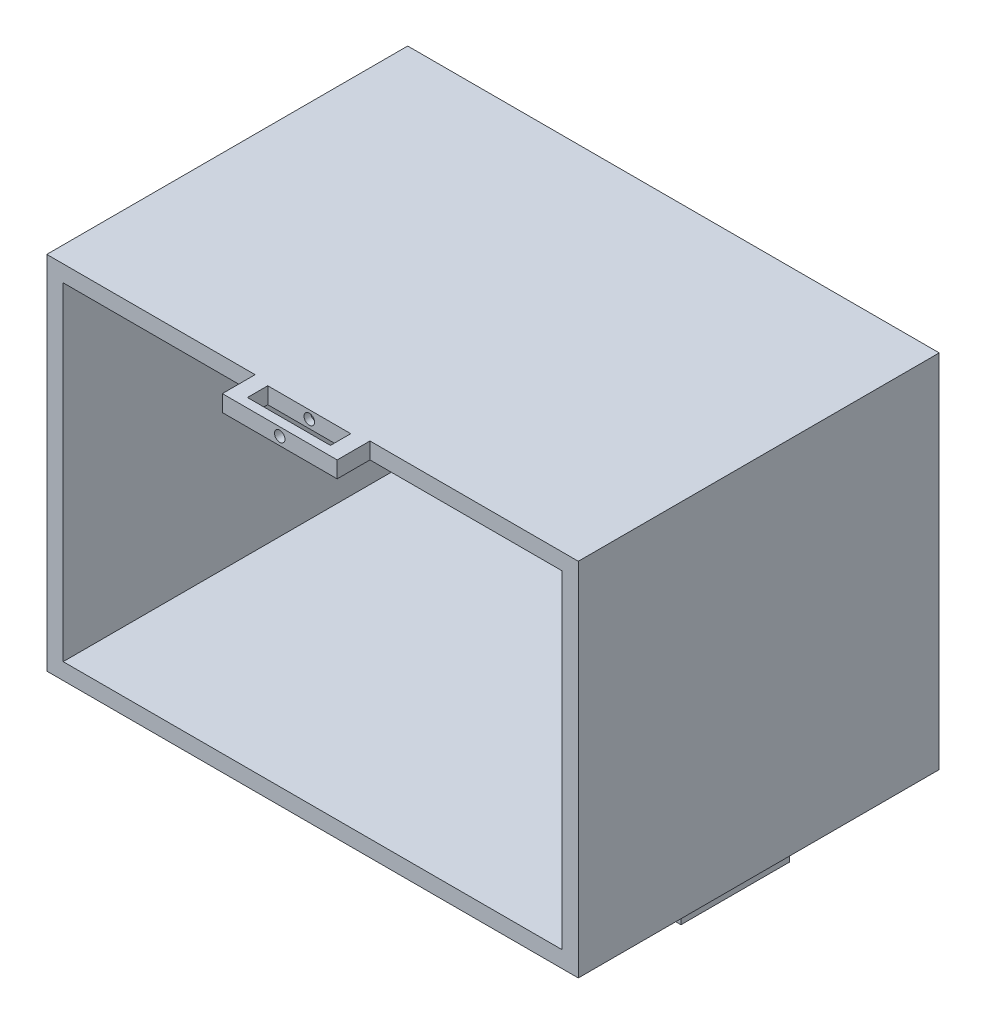
ISO-10303-21;
HEADER;
FILE_DESCRIPTION(('STEP AP214'),'2;1');
FILE_NAME('part.step','',(''),(''),'','','');
FILE_SCHEMA(('AUTOMOTIVE_DESIGN { 1 0 10303 214 1 1 1 1 }'));
ENDSEC;
DATA;
#1=APPLICATION_CONTEXT('core data for automotive mechanical design processes');
#2=APPLICATION_PROTOCOL_DEFINITION('international standard','automotive_design',2000,#1);
#3=PRODUCT_CONTEXT('',#1,'mechanical');
#4=PRODUCT('Part','Part','',(#3));
#5=PRODUCT_RELATED_PRODUCT_CATEGORY('part','',(#4));
#6=PRODUCT_DEFINITION_FORMATION('','',#4);
#7=PRODUCT_DEFINITION_CONTEXT('part definition',#1,'design');
#8=PRODUCT_DEFINITION('design','',#6,#7);
#9=PRODUCT_DEFINITION_SHAPE('','',#8);
#10=(LENGTH_UNIT() NAMED_UNIT(*) SI_UNIT(.MILLI.,.METRE.));
#11=(NAMED_UNIT(*) PLANE_ANGLE_UNIT() SI_UNIT($,.RADIAN.));
#12=(NAMED_UNIT(*) SI_UNIT($,.STERADIAN.) SOLID_ANGLE_UNIT());
#13=UNCERTAINTY_MEASURE_WITH_UNIT(LENGTH_MEASURE(1.E-05),#10,'distance_accuracy_value','');
#14=(GEOMETRIC_REPRESENTATION_CONTEXT(3) GLOBAL_UNCERTAINTY_ASSIGNED_CONTEXT((#13)) GLOBAL_UNIT_ASSIGNED_CONTEXT((#10,
#11,#12)) REPRESENTATION_CONTEXT('',''));
#15=CARTESIAN_POINT('',(0.,0.,0.));
#16=DIRECTION('',(0.,0.,1.));
#17=DIRECTION('',(1.,0.,0.));
#18=AXIS2_PLACEMENT_3D('',#15,#16,#17);
#19=CARTESIAN_POINT('',(0.,0.,55.));
#20=DIRECTION('',(0.,0.,1.));
#21=DIRECTION('',(1.,0.,0.));
#22=AXIS2_PLACEMENT_3D('',#19,#20,#21);
#23=PLANE('',#22);
#24=DIRECTION('',(-1.,0.,0.));
#25=VECTOR('',#24,1.);
#26=CARTESIAN_POINT('',(-81.,50.,55.));
#27=LINE('',#26,#25);
#28=CARTESIAN_POINT('',(-17.5,50.,55.));
#29=VERTEX_POINT('',#28);
#30=CARTESIAN_POINT('',(-76.,50.,55.));
#31=VERTEX_POINT('',#30);
#32=EDGE_CURVE('E433',#29,#31,#27,.T.);
#33=ORIENTED_EDGE('',*,*,#32,.F.);
#34=DIRECTION('',(0.,1.,0.));
#35=VECTOR('',#34,1.);
#36=CARTESIAN_POINT('',(-17.5,55.,55.));
#37=LINE('',#36,#35);
#38=CARTESIAN_POINT('',(-17.5,55.,55.));
#39=VERTEX_POINT('',#38);
#40=EDGE_CURVE('E271',#29,#39,#37,.T.);
#41=ORIENTED_EDGE('',*,*,#40,.T.);
#42=DIRECTION('',(-1.,0.,0.));
#43=VECTOR('',#42,1.);
#44=CARTESIAN_POINT('',(-81.,55.,55.));
#45=LINE('',#44,#43);
#46=CARTESIAN_POINT('',(-81.,55.,55.));
#47=VERTEX_POINT('',#46);
#48=EDGE_CURVE('E444',#39,#47,#45,.T.);
#49=ORIENTED_EDGE('',*,*,#48,.T.);
#50=DIRECTION('',(0.,-1.,0.));
#51=VECTOR('',#50,1.);
#52=CARTESIAN_POINT('',(-81.,55.,55.));
#53=LINE('',#52,#51);
#54=CARTESIAN_POINT('',(-81.,-55.,55.));
#55=VERTEX_POINT('',#54);
#56=EDGE_CURVE('E448',#47,#55,#53,.T.);
#57=ORIENTED_EDGE('',*,*,#56,.T.);
#58=DIRECTION('',(1.,0.,0.));
#59=VECTOR('',#58,1.);
#60=CARTESIAN_POINT('',(-81.,-55.,55.));
#61=LINE('',#60,#59);
#62=CARTESIAN_POINT('',(81.,-55.,55.));
#63=VERTEX_POINT('',#62);
#64=EDGE_CURVE('E450',#55,#63,#61,.T.);
#65=ORIENTED_EDGE('',*,*,#64,.T.);
#66=DIRECTION('',(0.,1.,0.));
#67=VECTOR('',#66,1.);
#68=CARTESIAN_POINT('',(81.,55.,55.));
#69=LINE('',#68,#67);
#70=CARTESIAN_POINT('',(81.,55.,55.));
#71=VERTEX_POINT('',#70);
#72=EDGE_CURVE('E441',#63,#71,#69,.T.);
#73=ORIENTED_EDGE('',*,*,#72,.T.);
#74=CARTESIAN_POINT('',(17.5,55.,55.));
#75=VERTEX_POINT('',#74);
#76=EDGE_CURVE('E446',#71,#75,#45,.T.);
#77=ORIENTED_EDGE('',*,*,#76,.T.);
#78=DIRECTION('',(0.,1.,0.));
#79=VECTOR('',#78,1.);
#80=CARTESIAN_POINT('',(17.5,55.,55.));
#81=LINE('',#80,#79);
#82=CARTESIAN_POINT('',(17.5,50.,55.));
#83=VERTEX_POINT('',#82);
#84=EDGE_CURVE('E275',#83,#75,#81,.T.);
#85=ORIENTED_EDGE('',*,*,#84,.F.);
#86=CARTESIAN_POINT('',(76.,50.,55.));
#87=VERTEX_POINT('',#86);
#88=EDGE_CURVE('E434',#87,#83,#27,.T.);
#89=ORIENTED_EDGE('',*,*,#88,.F.);
#90=DIRECTION('',(0.,1.,0.));
#91=VECTOR('',#90,1.);
#92=CARTESIAN_POINT('',(76.,55.,55.));
#93=LINE('',#92,#91);
#94=CARTESIAN_POINT('',(76.,-50.,55.));
#95=VERTEX_POINT('',#94);
#96=EDGE_CURVE('E431',#95,#87,#93,.T.);
#97=ORIENTED_EDGE('',*,*,#96,.F.);
#98=DIRECTION('',(1.,0.,0.));
#99=VECTOR('',#98,1.);
#100=CARTESIAN_POINT('',(-81.,-50.,55.));
#101=LINE('',#100,#99);
#102=CARTESIAN_POINT('',(-76.,-50.,55.));
#103=VERTEX_POINT('',#102);
#104=EDGE_CURVE('E421',#103,#95,#101,.T.);
#105=ORIENTED_EDGE('',*,*,#104,.F.);
#106=DIRECTION('',(0.,-1.,0.));
#107=VECTOR('',#106,1.);
#108=CARTESIAN_POINT('',(-76.,55.,55.));
#109=LINE('',#108,#107);
#110=EDGE_CURVE('E437',#31,#103,#109,.T.);
#111=ORIENTED_EDGE('',*,*,#110,.F.);
#112=EDGE_LOOP('',(#33,#41,#49,#57,#65,#73,#77,#85,#89,#97,#105,#111));
#113=FACE_BOUND('',#112,.T.);
#114=ADVANCED_FACE('F37',(#113),#23,.T.);
#115=CARTESIAN_POINT('',(-81.,-55.,55.));
#116=DIRECTION('',(0.,1.,0.));
#117=DIRECTION('',(0.,0.,1.));
#118=AXIS2_PLACEMENT_3D('',#115,#116,#117);
#119=PLANE('',#118);
#120=DIRECTION('',(1.,0.,0.));
#121=VECTOR('',#120,1.);
#122=CARTESIAN_POINT('',(-72.3,-55.,-18.));
#123=LINE('',#122,#121);
#124=CARTESIAN_POINT('',(-72.3,-55.,-18.));
#125=VERTEX_POINT('',#124);
#126=CARTESIAN_POINT('',(-55.3,-55.,-18.));
#127=VERTEX_POINT('',#126);
#128=EDGE_CURVE('E322',#125,#127,#123,.T.);
#129=ORIENTED_EDGE('',*,*,#128,.F.);
#130=DIRECTION('',(0.,0.,-1.));
#131=VECTOR('',#130,1.);
#132=CARTESIAN_POINT('',(-72.3,-55.,15.));
#133=LINE('',#132,#131);
#134=CARTESIAN_POINT('',(-72.3,-55.,15.));
#135=VERTEX_POINT('',#134);
#136=EDGE_CURVE('E400',#135,#125,#133,.T.);
#137=ORIENTED_EDGE('',*,*,#136,.F.);
#138=DIRECTION('',(-1.,0.,0.));
#139=VECTOR('',#138,1.);
#140=CARTESIAN_POINT('',(-72.3,-55.,15.));
#141=LINE('',#140,#139);
#142=CARTESIAN_POINT('',(-67.3,-55.,15.));
#143=VERTEX_POINT('',#142);
#144=EDGE_CURVE('E380',#143,#135,#141,.T.);
#145=ORIENTED_EDGE('',*,*,#144,.F.);
#146=DIRECTION('',(0.,0.,-1.));
#147=VECTOR('',#146,1.);
#148=CARTESIAN_POINT('',(-67.3,-55.,15.));
#149=LINE('',#148,#147);
#150=CARTESIAN_POINT('',(-67.3,-55.,-15.));
#151=VERTEX_POINT('',#150);
#152=EDGE_CURVE('E402',#143,#151,#149,.T.);
#153=ORIENTED_EDGE('',*,*,#152,.T.);
#154=DIRECTION('',(1.,0.,0.));
#155=VECTOR('',#154,1.);
#156=CARTESIAN_POINT('',(-72.3,-55.,-15.));
#157=LINE('',#156,#155);
#158=CARTESIAN_POINT('',(-55.3,-55.,-15.));
#159=VERTEX_POINT('',#158);
#160=EDGE_CURVE('E318',#151,#159,#157,.T.);
#161=ORIENTED_EDGE('',*,*,#160,.T.);
#162=DIRECTION('',(0.,0.,1.));
#163=VECTOR('',#162,1.);
#164=CARTESIAN_POINT('',(-55.3,-55.,-18.));
#165=LINE('',#164,#163);
#166=EDGE_CURVE('E331',#127,#159,#165,.T.);
#167=ORIENTED_EDGE('',*,*,#166,.F.);
#168=EDGE_LOOP('',(#129,#137,#145,#153,#161,#167));
#169=FACE_BOUND('',#168,.T.);
#170=DIRECTION('',(1.,0.,0.));
#171=VECTOR('',#170,1.);
#172=CARTESIAN_POINT('',(-81.,-55.,-55.));
#173=LINE('',#172,#171);
#174=CARTESIAN_POINT('',(-81.,-55.,-55.));
#175=VERTEX_POINT('',#174);
#176=CARTESIAN_POINT('',(81.,-55.,-55.));
#177=VERTEX_POINT('',#176);
#178=EDGE_CURVE('E445',#175,#177,#173,.T.);
#179=ORIENTED_EDGE('',*,*,#178,.T.);
#180=DIRECTION('',(0.,0.,-1.));
#181=VECTOR('',#180,1.);
#182=CARTESIAN_POINT('',(81.,-55.,55.));
#183=LINE('',#182,#181);
#184=EDGE_CURVE('E452',#63,#177,#183,.T.);
#185=ORIENTED_EDGE('',*,*,#184,.F.);
#186=ORIENTED_EDGE('',*,*,#64,.F.);
#187=DIRECTION('',(0.,0.,-1.));
#188=VECTOR('',#187,1.);
#189=CARTESIAN_POINT('',(-81.,-55.,55.));
#190=LINE('',#189,#188);
#191=EDGE_CURVE('E462',#55,#175,#190,.T.);
#192=ORIENTED_EDGE('',*,*,#191,.T.);
#193=EDGE_LOOP('',(#179,#185,#186,#192));
#194=FACE_BOUND('',#193,.T.);
#195=DIRECTION('',(0.,0.,-1.));
#196=VECTOR('',#195,1.);
#197=CARTESIAN_POINT('',(72.3,-55.,15.));
#198=LINE('',#197,#196);
#199=CARTESIAN_POINT('',(72.3,-55.,15.));
#200=VERTEX_POINT('',#199);
#201=CARTESIAN_POINT('',(72.3,-55.,-18.));
#202=VERTEX_POINT('',#201);
#203=EDGE_CURVE('E353',#200,#202,#198,.T.);
#204=ORIENTED_EDGE('',*,*,#203,.T.);
#205=DIRECTION('',(1.,0.,0.));
#206=VECTOR('',#205,1.);
#207=CARTESIAN_POINT('',(72.3,-55.,-18.));
#208=LINE('',#207,#206);
#209=CARTESIAN_POINT('',(55.3,-55.,-18.));
#210=VERTEX_POINT('',#209);
#211=EDGE_CURVE('E309',#210,#202,#208,.T.);
#212=ORIENTED_EDGE('',*,*,#211,.F.);
#213=DIRECTION('',(0.,0.,1.));
#214=VECTOR('',#213,1.);
#215=CARTESIAN_POINT('',(55.3,-55.,-18.));
#216=LINE('',#215,#214);
#217=CARTESIAN_POINT('',(55.3,-55.,-15.));
#218=VERTEX_POINT('',#217);
#219=EDGE_CURVE('E312',#210,#218,#216,.T.);
#220=ORIENTED_EDGE('',*,*,#219,.T.);
#221=DIRECTION('',(1.,0.,0.));
#222=VECTOR('',#221,1.);
#223=CARTESIAN_POINT('',(72.3,-55.,-15.));
#224=LINE('',#223,#222);
#225=CARTESIAN_POINT('',(67.3,-55.,-15.));
#226=VERTEX_POINT('',#225);
#227=EDGE_CURVE('E304',#218,#226,#224,.T.);
#228=ORIENTED_EDGE('',*,*,#227,.T.);
#229=DIRECTION('',(0.,0.,-1.));
#230=VECTOR('',#229,1.);
#231=CARTESIAN_POINT('',(67.3,-55.,15.));
#232=LINE('',#231,#230);
#233=CARTESIAN_POINT('',(67.3,-55.,15.));
#234=VERTEX_POINT('',#233);
#235=EDGE_CURVE('E369',#234,#226,#232,.T.);
#236=ORIENTED_EDGE('',*,*,#235,.F.);
#237=DIRECTION('',(-1.,0.,0.));
#238=VECTOR('',#237,1.);
#239=CARTESIAN_POINT('',(72.3,-55.,15.));
#240=LINE('',#239,#238);
#241=EDGE_CURVE('E338',#200,#234,#240,.T.);
#242=ORIENTED_EDGE('',*,*,#241,.F.);
#243=EDGE_LOOP('',(#204,#212,#220,#228,#236,#242));
#244=FACE_BOUND('',#243,.T.);
#245=ADVANCED_FACE('F480',(#169,#194,#244),#119,.F.);
#246=CARTESIAN_POINT('',(81.,55.,55.));
#247=DIRECTION('',(-1.,0.,0.));
#248=DIRECTION('',(0.,0.,1.));
#249=AXIS2_PLACEMENT_3D('',#246,#247,#248);
#250=PLANE('',#249);
#251=DIRECTION('',(0.,1.,0.));
#252=VECTOR('',#251,1.);
#253=CARTESIAN_POINT('',(81.,55.,-55.));
#254=LINE('',#253,#252);
#255=CARTESIAN_POINT('',(81.,55.,-55.));
#256=VERTEX_POINT('',#255);
#257=EDGE_CURVE('E415',#177,#256,#254,.T.);
#258=ORIENTED_EDGE('',*,*,#257,.T.);
#259=DIRECTION('',(0.,0.,-1.));
#260=VECTOR('',#259,1.);
#261=CARTESIAN_POINT('',(81.,55.,55.));
#262=LINE('',#261,#260);
#263=EDGE_CURVE('E11',#71,#256,#262,.T.);
#264=ORIENTED_EDGE('',*,*,#263,.F.);
#265=ORIENTED_EDGE('',*,*,#72,.F.);
#266=ORIENTED_EDGE('',*,*,#184,.T.);
#267=EDGE_LOOP('',(#258,#264,#265,#266));
#268=FACE_BOUND('',#267,.T.);
#269=ADVANCED_FACE('F39',(#268),#250,.F.);
#270=CARTESIAN_POINT('',(-81.,55.,55.));
#271=DIRECTION('',(0.,-1.,0.));
#272=DIRECTION('',(0.,0.,-1.));
#273=AXIS2_PLACEMENT_3D('',#270,#271,#272);
#274=PLANE('',#273);
#275=DIRECTION('',(-1.,0.,0.));
#276=VECTOR('',#275,1.);
#277=CARTESIAN_POINT('',(-12.65,55.,56.));
#278=LINE('',#277,#276);
#279=CARTESIAN_POINT('',(12.65,55.,56.));
#280=VERTEX_POINT('',#279);
#281=CARTESIAN_POINT('',(-12.65,55.,56.));
#282=VERTEX_POINT('',#281);
#283=EDGE_CURVE('E265',#280,#282,#278,.T.);
#284=ORIENTED_EDGE('',*,*,#283,.F.);
#285=DIRECTION('',(0.,0.,-1.));
#286=VECTOR('',#285,1.);
#287=CARTESIAN_POINT('',(12.65,55.,62.2));
#288=LINE('',#287,#286);
#289=CARTESIAN_POINT('',(12.65,55.,62.2));
#290=VERTEX_POINT('',#289);
#291=EDGE_CURVE('E53',#290,#280,#288,.T.);
#292=ORIENTED_EDGE('',*,*,#291,.F.);
#293=DIRECTION('',(1.,0.,0.));
#294=VECTOR('',#293,1.);
#295=CARTESIAN_POINT('',(-12.65,55.,62.2));
#296=LINE('',#295,#294);
#297=CARTESIAN_POINT('',(-12.65,55.,62.2));
#298=VERTEX_POINT('',#297);
#299=EDGE_CURVE('E253',#298,#290,#296,.T.);
#300=ORIENTED_EDGE('',*,*,#299,.F.);
#301=DIRECTION('',(0.,0.,1.));
#302=VECTOR('',#301,1.);
#303=CARTESIAN_POINT('',(-12.65,55.,62.2));
#304=LINE('',#303,#302);
#305=EDGE_CURVE('E256',#282,#298,#304,.T.);
#306=ORIENTED_EDGE('',*,*,#305,.F.);
#307=EDGE_LOOP('',(#284,#292,#300,#306));
#308=FACE_BOUND('',#307,.T.);
#309=DIRECTION('',(-1.,0.,0.));
#310=VECTOR('',#309,1.);
#311=CARTESIAN_POINT('',(-81.,55.,-55.));
#312=LINE('',#311,#310);
#313=CARTESIAN_POINT('',(-81.,55.,-55.));
#314=VERTEX_POINT('',#313);
#315=EDGE_CURVE('E455',#256,#314,#312,.T.);
#316=ORIENTED_EDGE('',*,*,#315,.T.);
#317=DIRECTION('',(0.,0.,-1.));
#318=VECTOR('',#317,1.);
#319=CARTESIAN_POINT('',(-81.,55.,55.));
#320=LINE('',#319,#318);
#321=EDGE_CURVE('E46',#47,#314,#320,.T.);
#322=ORIENTED_EDGE('',*,*,#321,.F.);
#323=ORIENTED_EDGE('',*,*,#48,.F.);
#324=DIRECTION('',(0.,0.,1.));
#325=VECTOR('',#324,1.);
#326=CARTESIAN_POINT('',(-17.5,55.,55.));
#327=LINE('',#326,#325);
#328=CARTESIAN_POINT('',(-17.5,55.,65.));
#329=VERTEX_POINT('',#328);
#330=EDGE_CURVE('E288',#39,#329,#327,.T.);
#331=ORIENTED_EDGE('',*,*,#330,.T.);
#332=DIRECTION('',(-1.,0.,0.));
#333=VECTOR('',#332,1.);
#334=CARTESIAN_POINT('',(17.5,55.,65.));
#335=LINE('',#334,#333);
#336=CARTESIAN_POINT('',(17.5,55.,65.));
#337=VERTEX_POINT('',#336);
#338=EDGE_CURVE('E296',#337,#329,#335,.T.);
#339=ORIENTED_EDGE('',*,*,#338,.F.);
#340=DIRECTION('',(0.,0.,1.));
#341=VECTOR('',#340,1.);
#342=CARTESIAN_POINT('',(17.5,55.,55.));
#343=LINE('',#342,#341);
#344=EDGE_CURVE('E278',#75,#337,#343,.T.);
#345=ORIENTED_EDGE('',*,*,#344,.F.);
#346=ORIENTED_EDGE('',*,*,#76,.F.);
#347=ORIENTED_EDGE('',*,*,#263,.T.);
#348=EDGE_LOOP('',(#316,#322,#323,#331,#339,#345,#346,#347));
#349=FACE_BOUND('',#348,.T.);
#350=ADVANCED_FACE('F490',(#308,#349),#274,.F.);
#351=CARTESIAN_POINT('',(-81.,55.,55.));
#352=DIRECTION('',(1.,0.,0.));
#353=DIRECTION('',(0.,0.,-1.));
#354=AXIS2_PLACEMENT_3D('',#351,#352,#353);
#355=PLANE('',#354);
#356=DIRECTION('',(0.,-1.,0.));
#357=VECTOR('',#356,1.);
#358=CARTESIAN_POINT('',(-81.,55.,-55.));
#359=LINE('',#358,#357);
#360=EDGE_CURVE('E457',#314,#175,#359,.T.);
#361=ORIENTED_EDGE('',*,*,#360,.T.);
#362=ORIENTED_EDGE('',*,*,#191,.F.);
#363=ORIENTED_EDGE('',*,*,#56,.F.);
#364=ORIENTED_EDGE('',*,*,#321,.T.);
#365=EDGE_LOOP('',(#361,#362,#363,#364));
#366=FACE_BOUND('',#365,.T.);
#367=ADVANCED_FACE('F470',(#366),#355,.F.);
#368=CARTESIAN_POINT('',(0.,0.,-55.));
#369=DIRECTION('',(0.,0.,1.));
#370=DIRECTION('',(1.,0.,0.));
#371=AXIS2_PLACEMENT_3D('',#368,#369,#370);
#372=PLANE('',#371);
#373=ORIENTED_EDGE('',*,*,#257,.F.);
#374=ORIENTED_EDGE('',*,*,#178,.F.);
#375=ORIENTED_EDGE('',*,*,#360,.F.);
#376=ORIENTED_EDGE('',*,*,#315,.F.);
#377=EDGE_LOOP('',(#373,#374,#375,#376));
#378=FACE_BOUND('',#377,.T.);
#379=ADVANCED_FACE('F477',(#378),#372,.F.);
#380=CARTESIAN_POINT('',(76.,55.,55.));
#381=DIRECTION('',(-1.,0.,0.));
#382=DIRECTION('',(0.,0.,1.));
#383=AXIS2_PLACEMENT_3D('',#380,#381,#382);
#384=PLANE('',#383);
#385=DIRECTION('',(0.,1.,0.));
#386=VECTOR('',#385,1.);
#387=CARTESIAN_POINT('',(76.,55.,-50.));
#388=LINE('',#387,#386);
#389=CARTESIAN_POINT('',(76.,-50.,-50.));
#390=VERTEX_POINT('',#389);
#391=CARTESIAN_POINT('',(76.,50.,-50.));
#392=VERTEX_POINT('',#391);
#393=EDGE_CURVE('E408',#390,#392,#388,.T.);
#394=ORIENTED_EDGE('',*,*,#393,.F.);
#395=DIRECTION('',(0.,0.,-1.));
#396=VECTOR('',#395,1.);
#397=CARTESIAN_POINT('',(76.,-50.,55.));
#398=LINE('',#397,#396);
#399=EDGE_CURVE('E417',#95,#390,#398,.T.);
#400=ORIENTED_EDGE('',*,*,#399,.F.);
#401=ORIENTED_EDGE('',*,*,#96,.T.);
#402=DIRECTION('',(0.,0.,-1.));
#403=VECTOR('',#402,1.);
#404=CARTESIAN_POINT('',(76.,50.,55.));
#405=LINE('',#404,#403);
#406=EDGE_CURVE('E412',#87,#392,#405,.T.);
#407=ORIENTED_EDGE('',*,*,#406,.T.);
#408=EDGE_LOOP('',(#394,#400,#401,#407));
#409=FACE_BOUND('',#408,.T.);
#410=ADVANCED_FACE('F511',(#409),#384,.T.);
#411=CARTESIAN_POINT('',(-81.,50.,55.));
#412=DIRECTION('',(0.,-1.,0.));
#413=DIRECTION('',(0.,0.,-1.));
#414=AXIS2_PLACEMENT_3D('',#411,#412,#413);
#415=PLANE('',#414);
#416=DIRECTION('',(0.,0.,-1.));
#417=VECTOR('',#416,1.);
#418=CARTESIAN_POINT('',(12.65,50.,62.2));
#419=LINE('',#418,#417);
#420=CARTESIAN_POINT('',(12.65,50.,62.2));
#421=VERTEX_POINT('',#420);
#422=CARTESIAN_POINT('',(12.65,50.,56.));
#423=VERTEX_POINT('',#422);
#424=EDGE_CURVE('E237',#421,#423,#419,.T.);
#425=ORIENTED_EDGE('',*,*,#424,.T.);
#426=DIRECTION('',(-1.,0.,0.));
#427=VECTOR('',#426,1.);
#428=CARTESIAN_POINT('',(-12.65,50.,56.));
#429=LINE('',#428,#427);
#430=CARTESIAN_POINT('',(-12.65,50.,56.));
#431=VERTEX_POINT('',#430);
#432=EDGE_CURVE('E246',#423,#431,#429,.T.);
#433=ORIENTED_EDGE('',*,*,#432,.T.);
#434=DIRECTION('',(0.,0.,1.));
#435=VECTOR('',#434,1.);
#436=CARTESIAN_POINT('',(-12.65,50.,62.2));
#437=LINE('',#436,#435);
#438=CARTESIAN_POINT('',(-12.65,50.,62.2));
#439=VERTEX_POINT('',#438);
#440=EDGE_CURVE('E61',#431,#439,#437,.T.);
#441=ORIENTED_EDGE('',*,*,#440,.T.);
#442=DIRECTION('',(1.,0.,0.));
#443=VECTOR('',#442,1.);
#444=CARTESIAN_POINT('',(-12.65,50.,62.2));
#445=LINE('',#444,#443);
#446=EDGE_CURVE('E243',#439,#421,#445,.T.);
#447=ORIENTED_EDGE('',*,*,#446,.T.);
#448=EDGE_LOOP('',(#425,#433,#441,#447));
#449=FACE_BOUND('',#448,.T.);
#450=DIRECTION('',(-1.,0.,0.));
#451=VECTOR('',#450,1.);
#452=CARTESIAN_POINT('',(-81.,50.,-50.));
#453=LINE('',#452,#451);
#454=CARTESIAN_POINT('',(-76.,50.,-50.));
#455=VERTEX_POINT('',#454);
#456=EDGE_CURVE('E411',#392,#455,#453,.T.);
#457=ORIENTED_EDGE('',*,*,#456,.F.);
#458=ORIENTED_EDGE('',*,*,#406,.F.);
#459=ORIENTED_EDGE('',*,*,#88,.T.);
#460=DIRECTION('',(0.,0.,-1.));
#461=VECTOR('',#460,1.);
#462=CARTESIAN_POINT('',(17.5,50.,55.));
#463=LINE('',#462,#461);
#464=CARTESIAN_POINT('',(17.5,50.,65.));
#465=VERTEX_POINT('',#464);
#466=EDGE_CURVE('E283',#465,#83,#463,.T.);
#467=ORIENTED_EDGE('',*,*,#466,.F.);
#468=DIRECTION('',(-1.,0.,0.));
#469=VECTOR('',#468,1.);
#470=CARTESIAN_POINT('',(17.5,50.,65.));
#471=LINE('',#470,#469);
#472=CARTESIAN_POINT('',(-17.5,50.,65.));
#473=VERTEX_POINT('',#472);
#474=EDGE_CURVE('E286',#465,#473,#471,.T.);
#475=ORIENTED_EDGE('',*,*,#474,.T.);
#476=DIRECTION('',(0.,0.,-1.));
#477=VECTOR('',#476,1.);
#478=CARTESIAN_POINT('',(-17.5,50.,55.));
#479=LINE('',#478,#477);
#480=EDGE_CURVE('E279',#473,#29,#479,.T.);
#481=ORIENTED_EDGE('',*,*,#480,.T.);
#482=ORIENTED_EDGE('',*,*,#32,.T.);
#483=DIRECTION('',(0.,0.,-1.));
#484=VECTOR('',#483,1.);
#485=CARTESIAN_POINT('',(-76.,50.,55.));
#486=LINE('',#485,#484);
#487=EDGE_CURVE('E416',#31,#455,#486,.T.);
#488=ORIENTED_EDGE('',*,*,#487,.T.);
#489=EDGE_LOOP('',(#457,#458,#459,#467,#475,#481,#482,#488));
#490=FACE_BOUND('',#489,.T.);
#491=ADVANCED_FACE('F250',(#449,#490),#415,.T.);
#492=CARTESIAN_POINT('',(-76.,55.,55.));
#493=DIRECTION('',(1.,0.,0.));
#494=DIRECTION('',(0.,0.,-1.));
#495=AXIS2_PLACEMENT_3D('',#492,#493,#494);
#496=PLANE('',#495);
#497=DIRECTION('',(0.,-1.,0.));
#498=VECTOR('',#497,1.);
#499=CARTESIAN_POINT('',(-76.,55.,-50.));
#500=LINE('',#499,#498);
#501=CARTESIAN_POINT('',(-76.,-50.,-50.));
#502=VERTEX_POINT('',#501);
#503=EDGE_CURVE('E423',#455,#502,#500,.T.);
#504=ORIENTED_EDGE('',*,*,#503,.F.);
#505=ORIENTED_EDGE('',*,*,#487,.F.);
#506=ORIENTED_EDGE('',*,*,#110,.T.);
#507=DIRECTION('',(0.,0.,-1.));
#508=VECTOR('',#507,1.);
#509=CARTESIAN_POINT('',(-76.,-50.,55.));
#510=LINE('',#509,#508);
#511=EDGE_CURVE('E420',#103,#502,#510,.T.);
#512=ORIENTED_EDGE('',*,*,#511,.T.);
#513=EDGE_LOOP('',(#504,#505,#506,#512));
#514=FACE_BOUND('',#513,.T.);
#515=ADVANCED_FACE('F520',(#514),#496,.T.);
#516=CARTESIAN_POINT('',(-81.,-50.,55.));
#517=DIRECTION('',(0.,1.,0.));
#518=DIRECTION('',(0.,0.,1.));
#519=AXIS2_PLACEMENT_3D('',#516,#517,#518);
#520=PLANE('',#519);
#521=DIRECTION('',(1.,0.,0.));
#522=VECTOR('',#521,1.);
#523=CARTESIAN_POINT('',(-81.,-50.,-50.));
#524=LINE('',#523,#522);
#525=EDGE_CURVE('E427',#502,#390,#524,.T.);
#526=ORIENTED_EDGE('',*,*,#525,.F.);
#527=ORIENTED_EDGE('',*,*,#511,.F.);
#528=ORIENTED_EDGE('',*,*,#104,.T.);
#529=ORIENTED_EDGE('',*,*,#399,.T.);
#530=EDGE_LOOP('',(#526,#527,#528,#529));
#531=FACE_BOUND('',#530,.T.);
#532=ADVANCED_FACE('F518',(#531),#520,.T.);
#533=CARTESIAN_POINT('',(0.,0.,-50.));
#534=DIRECTION('',(0.,0.,1.));
#535=DIRECTION('',(1.,0.,0.));
#536=AXIS2_PLACEMENT_3D('',#533,#534,#535);
#537=PLANE('',#536);
#538=ORIENTED_EDGE('',*,*,#393,.T.);
#539=ORIENTED_EDGE('',*,*,#456,.T.);
#540=ORIENTED_EDGE('',*,*,#503,.T.);
#541=ORIENTED_EDGE('',*,*,#525,.T.);
#542=EDGE_LOOP('',(#538,#539,#540,#541));
#543=FACE_BOUND('',#542,.T.);
#544=ADVANCED_FACE('F515',(#543),#537,.T.);
#545=CARTESIAN_POINT('',(-67.3,-60.3,15.));
#546=DIRECTION('',(0.,-1.,0.));
#547=DIRECTION('',(0.,0.,-1.));
#548=AXIS2_PLACEMENT_3D('',#545,#546,#547);
#549=PLANE('',#548);
#550=DIRECTION('',(-1.,0.,0.));
#551=VECTOR('',#550,1.);
#552=CARTESIAN_POINT('',(-67.3,-60.3,-15.));
#553=LINE('',#552,#551);
#554=CARTESIAN_POINT('',(-55.3,-60.3,-15.));
#555=VERTEX_POINT('',#554);
#556=CARTESIAN_POINT('',(-67.3,-60.3,-15.));
#557=VERTEX_POINT('',#556);
#558=EDGE_CURVE('E372',#555,#557,#553,.T.);
#559=ORIENTED_EDGE('',*,*,#558,.T.);
#560=DIRECTION('',(0.,0.,-1.));
#561=VECTOR('',#560,1.);
#562=CARTESIAN_POINT('',(-67.3,-60.3,15.));
#563=LINE('',#562,#561);
#564=CARTESIAN_POINT('',(-67.3,-60.3,15.));
#565=VERTEX_POINT('',#564);
#566=EDGE_CURVE('E405',#565,#557,#563,.T.);
#567=ORIENTED_EDGE('',*,*,#566,.F.);
#568=DIRECTION('',(-1.,0.,0.));
#569=VECTOR('',#568,1.);
#570=CARTESIAN_POINT('',(-67.3,-60.3,15.));
#571=LINE('',#570,#569);
#572=CARTESIAN_POINT('',(-55.3,-60.3,15.));
#573=VERTEX_POINT('',#572);
#574=EDGE_CURVE('E373',#573,#565,#571,.T.);
#575=ORIENTED_EDGE('',*,*,#574,.F.);
#576=DIRECTION('',(0.,0.,-1.));
#577=VECTOR('',#576,1.);
#578=CARTESIAN_POINT('',(-55.3,-60.3,15.));
#579=LINE('',#578,#577);
#580=EDGE_CURVE('E389',#573,#555,#579,.T.);
#581=ORIENTED_EDGE('',*,*,#580,.T.);
#582=EDGE_LOOP('',(#559,#567,#575,#581));
#583=FACE_BOUND('',#582,.T.);
#584=ADVANCED_FACE('F639',(#583),#549,.F.);
#585=CARTESIAN_POINT('',(-67.3,-55.,15.));
#586=DIRECTION('',(-1.,0.,0.));
#587=DIRECTION('',(0.,0.,1.));
#588=AXIS2_PLACEMENT_3D('',#585,#586,#587);
#589=PLANE('',#588);
#590=DIRECTION('',(0.,1.,0.));
#591=VECTOR('',#590,1.);
#592=CARTESIAN_POINT('',(-67.3,-55.,-15.));
#593=LINE('',#592,#591);
#594=EDGE_CURVE('E377',#557,#151,#593,.T.);
#595=ORIENTED_EDGE('',*,*,#594,.T.);
#596=ORIENTED_EDGE('',*,*,#152,.F.);
#597=DIRECTION('',(0.,1.,0.));
#598=VECTOR('',#597,1.);
#599=CARTESIAN_POINT('',(-67.3,-55.,15.));
#600=LINE('',#599,#598);
#601=EDGE_CURVE('E376',#565,#143,#600,.T.);
#602=ORIENTED_EDGE('',*,*,#601,.F.);
#603=ORIENTED_EDGE('',*,*,#566,.T.);
#604=EDGE_LOOP('',(#595,#596,#602,#603));
#605=FACE_BOUND('',#604,.T.);
#606=ADVANCED_FACE('F635',(#605),#589,.F.);
#607=CARTESIAN_POINT('',(-72.3,-55.,15.));
#608=DIRECTION('',(1.,0.,0.));
#609=DIRECTION('',(0.,0.,-1.));
#610=AXIS2_PLACEMENT_3D('',#607,#608,#609);
#611=PLANE('',#610);
#612=ORIENTED_EDGE('',*,*,#136,.T.);
#613=DIRECTION('',(0.,1.,0.));
#614=VECTOR('',#613,1.);
#615=CARTESIAN_POINT('',(-72.3,-65.3,-18.));
#616=LINE('',#615,#614);
#617=CARTESIAN_POINT('',(-72.3,-65.3,-18.));
#618=VERTEX_POINT('',#617);
#619=EDGE_CURVE('E319',#618,#125,#616,.T.);
#620=ORIENTED_EDGE('',*,*,#619,.F.);
#621=DIRECTION('',(0.,0.,-1.));
#622=VECTOR('',#621,1.);
#623=CARTESIAN_POINT('',(-72.3,-65.3,15.));
#624=LINE('',#623,#622);
#625=CARTESIAN_POINT('',(-72.3,-65.3,15.));
#626=VERTEX_POINT('',#625);
#627=EDGE_CURVE('E398',#626,#618,#624,.T.);
#628=ORIENTED_EDGE('',*,*,#627,.F.);
#629=DIRECTION('',(0.,-1.,0.));
#630=VECTOR('',#629,1.);
#631=CARTESIAN_POINT('',(-72.3,-55.,15.));
#632=LINE('',#631,#630);
#633=EDGE_CURVE('E383',#135,#626,#632,.T.);
#634=ORIENTED_EDGE('',*,*,#633,.F.);
#635=EDGE_LOOP('',(#612,#620,#628,#634));
#636=FACE_BOUND('',#635,.T.);
#637=ADVANCED_FACE('F631',(#636),#611,.F.);
#638=CARTESIAN_POINT('',(-55.3,-65.3,15.));
#639=DIRECTION('',(0.,1.,0.));
#640=DIRECTION('',(0.,0.,1.));
#641=AXIS2_PLACEMENT_3D('',#638,#639,#640);
#642=PLANE('',#641);
#643=ORIENTED_EDGE('',*,*,#627,.T.);
#644=DIRECTION('',(-1.,0.,0.));
#645=VECTOR('',#644,1.);
#646=CARTESIAN_POINT('',(-72.3,-65.3,-18.));
#647=LINE('',#646,#645);
#648=CARTESIAN_POINT('',(-55.3,-65.3,-18.));
#649=VERTEX_POINT('',#648);
#650=EDGE_CURVE('E328',#649,#618,#647,.T.);
#651=ORIENTED_EDGE('',*,*,#650,.F.);
#652=DIRECTION('',(0.,0.,-1.));
#653=VECTOR('',#652,1.);
#654=CARTESIAN_POINT('',(-55.3,-65.3,15.));
#655=LINE('',#654,#653);
#656=CARTESIAN_POINT('',(-55.3,-65.3,15.));
#657=VERTEX_POINT('',#656);
#658=EDGE_CURVE('E396',#657,#649,#655,.T.);
#659=ORIENTED_EDGE('',*,*,#658,.F.);
#660=DIRECTION('',(1.,0.,0.));
#661=VECTOR('',#660,1.);
#662=CARTESIAN_POINT('',(-55.3,-65.3,15.));
#663=LINE('',#662,#661);
#664=EDGE_CURVE('E385',#626,#657,#663,.T.);
#665=ORIENTED_EDGE('',*,*,#664,.F.);
#666=EDGE_LOOP('',(#643,#651,#659,#665));
#667=FACE_BOUND('',#666,.T.);
#668=ADVANCED_FACE('F627',(#667),#642,.F.);
#669=CARTESIAN_POINT('',(-55.3,-65.3,15.));
#670=DIRECTION('',(-1.,0.,0.));
#671=DIRECTION('',(0.,0.,1.));
#672=AXIS2_PLACEMENT_3D('',#669,#670,#671);
#673=PLANE('',#672);
#674=ORIENTED_EDGE('',*,*,#658,.T.);
#675=DIRECTION('',(0.,-1.,0.));
#676=VECTOR('',#675,1.);
#677=CARTESIAN_POINT('',(-55.3,-65.3,-18.));
#678=LINE('',#677,#676);
#679=EDGE_CURVE('E325',#127,#649,#678,.T.);
#680=ORIENTED_EDGE('',*,*,#679,.F.);
#681=ORIENTED_EDGE('',*,*,#166,.T.);
#682=DIRECTION('',(0.,-1.,0.));
#683=VECTOR('',#682,1.);
#684=CARTESIAN_POINT('',(-55.3,-65.3,-15.));
#685=LINE('',#684,#683);
#686=EDGE_CURVE('E323',#159,#555,#685,.T.);
#687=ORIENTED_EDGE('',*,*,#686,.T.);
#688=ORIENTED_EDGE('',*,*,#580,.F.);
#689=DIRECTION('',(0.,1.,0.));
#690=VECTOR('',#689,1.);
#691=CARTESIAN_POINT('',(-55.3,-65.3,15.));
#692=LINE('',#691,#690);
#693=EDGE_CURVE('E387',#657,#573,#692,.T.);
#694=ORIENTED_EDGE('',*,*,#693,.F.);
#695=EDGE_LOOP('',(#674,#680,#681,#687,#688,#694));
#696=FACE_BOUND('',#695,.T.);
#697=ADVANCED_FACE('F623',(#696),#673,.F.);
#698=CARTESIAN_POINT('',(0.,0.,15.));
#699=DIRECTION('',(0.,0.,1.));
#700=DIRECTION('',(1.,0.,0.));
#701=AXIS2_PLACEMENT_3D('',#698,#699,#700);
#702=PLANE('',#701);
#703=ORIENTED_EDGE('',*,*,#574,.T.);
#704=ORIENTED_EDGE('',*,*,#601,.T.);
#705=ORIENTED_EDGE('',*,*,#144,.T.);
#706=ORIENTED_EDGE('',*,*,#633,.T.);
#707=ORIENTED_EDGE('',*,*,#664,.T.);
#708=ORIENTED_EDGE('',*,*,#693,.T.);
#709=EDGE_LOOP('',(#703,#704,#705,#706,#707,#708));
#710=FACE_BOUND('',#709,.T.);
#711=ADVANCED_FACE('F619',(#710),#702,.T.);
#712=CARTESIAN_POINT('',(67.3,-55.,15.));
#713=DIRECTION('',(1.,0.,0.));
#714=DIRECTION('',(0.,1.,0.));
#715=AXIS2_PLACEMENT_3D('',#712,#713,#714);
#716=PLANE('',#715);
#717=DIRECTION('',(0.,-1.,0.));
#718=VECTOR('',#717,1.);
#719=CARTESIAN_POINT('',(67.3,-55.,-15.));
#720=LINE('',#719,#718);
#721=CARTESIAN_POINT('',(67.3000000000001,-60.3,-15.));
#722=VERTEX_POINT('',#721);
#723=EDGE_CURVE('E337',#226,#722,#720,.T.);
#724=ORIENTED_EDGE('',*,*,#723,.T.);
#725=DIRECTION('',(0.,0.,-1.));
#726=VECTOR('',#725,1.);
#727=CARTESIAN_POINT('',(67.3000000000001,-60.3,15.));
#728=LINE('',#727,#726);
#729=CARTESIAN_POINT('',(67.3000000000001,-60.3,15.));
#730=VERTEX_POINT('',#729);
#731=EDGE_CURVE('E366',#730,#722,#728,.T.);
#732=ORIENTED_EDGE('',*,*,#731,.F.);
#733=DIRECTION('',(0.,-1.,0.));
#734=VECTOR('',#733,1.);
#735=CARTESIAN_POINT('',(67.3,-55.,15.));
#736=LINE('',#735,#734);
#737=EDGE_CURVE('E341',#234,#730,#736,.T.);
#738=ORIENTED_EDGE('',*,*,#737,.F.);
#739=ORIENTED_EDGE('',*,*,#235,.T.);
#740=EDGE_LOOP('',(#724,#732,#738,#739));
#741=FACE_BOUND('',#740,.T.);
#742=ADVANCED_FACE('F615',(#741),#716,.F.);
#743=CARTESIAN_POINT('',(67.3000000000001,-60.3,15.));
#744=DIRECTION('',(0.,-1.,0.));
#745=DIRECTION('',(0.,0.,-1.));
#746=AXIS2_PLACEMENT_3D('',#743,#744,#745);
#747=PLANE('',#746);
#748=DIRECTION('',(-1.,0.,0.));
#749=VECTOR('',#748,1.);
#750=CARTESIAN_POINT('',(67.3000000000001,-60.3,-15.));
#751=LINE('',#750,#749);
#752=CARTESIAN_POINT('',(55.3,-60.3,-15.));
#753=VERTEX_POINT('',#752);
#754=EDGE_CURVE('E342',#722,#753,#751,.T.);
#755=ORIENTED_EDGE('',*,*,#754,.T.);
#756=DIRECTION('',(0.,0.,-1.));
#757=VECTOR('',#756,1.);
#758=CARTESIAN_POINT('',(55.3,-60.3,15.));
#759=LINE('',#758,#757);
#760=CARTESIAN_POINT('',(55.3,-60.3,15.));
#761=VERTEX_POINT('',#760);
#762=EDGE_CURVE('E363',#761,#753,#759,.T.);
#763=ORIENTED_EDGE('',*,*,#762,.F.);
#764=DIRECTION('',(-1.,0.,0.));
#765=VECTOR('',#764,1.);
#766=CARTESIAN_POINT('',(67.3000000000001,-60.3,15.));
#767=LINE('',#766,#765);
#768=EDGE_CURVE('E344',#730,#761,#767,.T.);
#769=ORIENTED_EDGE('',*,*,#768,.F.);
#770=ORIENTED_EDGE('',*,*,#731,.T.);
#771=EDGE_LOOP('',(#755,#763,#769,#770));
#772=FACE_BOUND('',#771,.T.);
#773=ADVANCED_FACE('F611',(#772),#747,.F.);
#774=CARTESIAN_POINT('',(55.3,-65.3,15.));
#775=DIRECTION('',(1.,0.,0.));
#776=DIRECTION('',(0.,0.,-1.));
#777=AXIS2_PLACEMENT_3D('',#774,#775,#776);
#778=PLANE('',#777);
#779=ORIENTED_EDGE('',*,*,#762,.T.);
#780=DIRECTION('',(0.,1.,0.));
#781=VECTOR('',#780,1.);
#782=CARTESIAN_POINT('',(55.3,-65.3,-15.));
#783=LINE('',#782,#781);
#784=EDGE_CURVE('E299',#753,#218,#783,.T.);
#785=ORIENTED_EDGE('',*,*,#784,.T.);
#786=ORIENTED_EDGE('',*,*,#219,.F.);
#787=DIRECTION('',(0.,1.,0.));
#788=VECTOR('',#787,1.);
#789=CARTESIAN_POINT('',(55.3,-65.3,-18.));
#790=LINE('',#789,#788);
#791=CARTESIAN_POINT('',(55.3,-65.3,-18.));
#792=VERTEX_POINT('',#791);
#793=EDGE_CURVE('E307',#792,#210,#790,.T.);
#794=ORIENTED_EDGE('',*,*,#793,.F.);
#795=DIRECTION('',(0.,0.,-1.));
#796=VECTOR('',#795,1.);
#797=CARTESIAN_POINT('',(55.3,-65.3,15.));
#798=LINE('',#797,#796);
#799=CARTESIAN_POINT('',(55.3,-65.3,15.));
#800=VERTEX_POINT('',#799);
#801=EDGE_CURVE('E361',#800,#792,#798,.T.);
#802=ORIENTED_EDGE('',*,*,#801,.F.);
#803=DIRECTION('',(0.,-1.,0.));
#804=VECTOR('',#803,1.);
#805=CARTESIAN_POINT('',(55.3,-65.3,15.));
#806=LINE('',#805,#804);
#807=EDGE_CURVE('E346',#761,#800,#806,.T.);
#808=ORIENTED_EDGE('',*,*,#807,.F.);
#809=EDGE_LOOP('',(#779,#785,#786,#794,#802,#808));
#810=FACE_BOUND('',#809,.T.);
#811=ADVANCED_FACE('F607',(#810),#778,.F.);
#812=CARTESIAN_POINT('',(55.3,-65.3,15.));
#813=DIRECTION('',(0.,1.,0.));
#814=DIRECTION('',(0.,0.,1.));
#815=AXIS2_PLACEMENT_3D('',#812,#813,#814);
#816=PLANE('',#815);
#817=ORIENTED_EDGE('',*,*,#801,.T.);
#818=DIRECTION('',(-1.,0.,0.));
#819=VECTOR('',#818,1.);
#820=CARTESIAN_POINT('',(72.3,-65.3,-18.));
#821=LINE('',#820,#819);
#822=CARTESIAN_POINT('',(72.3,-65.3,-18.));
#823=VERTEX_POINT('',#822);
#824=EDGE_CURVE('E303',#823,#792,#821,.T.);
#825=ORIENTED_EDGE('',*,*,#824,.F.);
#826=DIRECTION('',(0.,0.,-1.));
#827=VECTOR('',#826,1.);
#828=CARTESIAN_POINT('',(72.3000000000001,-65.3,15.));
#829=LINE('',#828,#827);
#830=CARTESIAN_POINT('',(72.3000000000001,-65.3,15.));
#831=VERTEX_POINT('',#830);
#832=EDGE_CURVE('E359',#831,#823,#829,.T.);
#833=ORIENTED_EDGE('',*,*,#832,.F.);
#834=DIRECTION('',(1.,0.,0.));
#835=VECTOR('',#834,1.);
#836=CARTESIAN_POINT('',(55.3,-65.3,15.));
#837=LINE('',#836,#835);
#838=EDGE_CURVE('E348',#800,#831,#837,.T.);
#839=ORIENTED_EDGE('',*,*,#838,.F.);
#840=EDGE_LOOP('',(#817,#825,#833,#839));
#841=FACE_BOUND('',#840,.T.);
#842=ADVANCED_FACE('F603',(#841),#816,.F.);
#843=CARTESIAN_POINT('',(72.3,-55.,15.));
#844=DIRECTION('',(-1.,0.,0.));
#845=DIRECTION('',(0.,-1.,0.));
#846=AXIS2_PLACEMENT_3D('',#843,#844,#845);
#847=PLANE('',#846);
#848=ORIENTED_EDGE('',*,*,#832,.T.);
#849=DIRECTION('',(0.,-1.,0.));
#850=VECTOR('',#849,1.);
#851=CARTESIAN_POINT('',(72.3,-65.3,-18.));
#852=LINE('',#851,#850);
#853=EDGE_CURVE('E300',#202,#823,#852,.T.);
#854=ORIENTED_EDGE('',*,*,#853,.F.);
#855=ORIENTED_EDGE('',*,*,#203,.F.);
#856=DIRECTION('',(0.,1.,0.));
#857=VECTOR('',#856,1.);
#858=CARTESIAN_POINT('',(72.3,-55.,15.));
#859=LINE('',#858,#857);
#860=EDGE_CURVE('E350',#831,#200,#859,.T.);
#861=ORIENTED_EDGE('',*,*,#860,.F.);
#862=EDGE_LOOP('',(#848,#854,#855,#861));
#863=FACE_BOUND('',#862,.T.);
#864=ADVANCED_FACE('F599',(#863),#847,.F.);
#865=CARTESIAN_POINT('',(0.,0.,15.));
#866=DIRECTION('',(0.,0.,1.));
#867=DIRECTION('',(1.,0.,0.));
#868=AXIS2_PLACEMENT_3D('',#865,#866,#867);
#869=PLANE('',#868);
#870=ORIENTED_EDGE('',*,*,#241,.T.);
#871=ORIENTED_EDGE('',*,*,#737,.T.);
#872=ORIENTED_EDGE('',*,*,#768,.T.);
#873=ORIENTED_EDGE('',*,*,#807,.T.);
#874=ORIENTED_EDGE('',*,*,#838,.T.);
#875=ORIENTED_EDGE('',*,*,#860,.T.);
#876=EDGE_LOOP('',(#870,#871,#872,#873,#874,#875));
#877=FACE_BOUND('',#876,.T.);
#878=ADVANCED_FACE('F595',(#877),#869,.T.);
#879=CARTESIAN_POINT('',(0.,0.,-15.));
#880=DIRECTION('',(0.,0.,-1.));
#881=DIRECTION('',(-1.,0.,0.));
#882=AXIS2_PLACEMENT_3D('',#879,#880,#881);
#883=PLANE('',#882);
#884=ORIENTED_EDGE('',*,*,#594,.F.);
#885=ORIENTED_EDGE('',*,*,#558,.F.);
#886=ORIENTED_EDGE('',*,*,#686,.F.);
#887=ORIENTED_EDGE('',*,*,#160,.F.);
#888=EDGE_LOOP('',(#884,#885,#886,#887));
#889=FACE_BOUND('',#888,.T.);
#890=ADVANCED_FACE('F591',(#889),#883,.F.);
#891=CARTESIAN_POINT('',(0.,0.,-18.));
#892=DIRECTION('',(0.,0.,-1.));
#893=DIRECTION('',(-1.,0.,0.));
#894=AXIS2_PLACEMENT_3D('',#891,#892,#893);
#895=PLANE('',#894);
#896=ORIENTED_EDGE('',*,*,#619,.T.);
#897=ORIENTED_EDGE('',*,*,#128,.T.);
#898=ORIENTED_EDGE('',*,*,#679,.T.);
#899=ORIENTED_EDGE('',*,*,#650,.T.);
#900=EDGE_LOOP('',(#896,#897,#898,#899));
#901=FACE_BOUND('',#900,.T.);
#902=ADVANCED_FACE('F587',(#901),#895,.T.);
#903=CARTESIAN_POINT('',(0.,0.,-15.));
#904=DIRECTION('',(0.,0.,1.));
#905=DIRECTION('',(1.,0.,0.));
#906=AXIS2_PLACEMENT_3D('',#903,#904,#905);
#907=PLANE('',#906);
#908=ORIENTED_EDGE('',*,*,#723,.F.);
#909=ORIENTED_EDGE('',*,*,#227,.F.);
#910=ORIENTED_EDGE('',*,*,#784,.F.);
#911=ORIENTED_EDGE('',*,*,#754,.F.);
#912=EDGE_LOOP('',(#908,#909,#910,#911));
#913=FACE_BOUND('',#912,.T.);
#914=ADVANCED_FACE('F583',(#913),#907,.T.);
#915=CARTESIAN_POINT('',(0.,0.,-18.));
#916=DIRECTION('',(0.,0.,1.));
#917=DIRECTION('',(1.,0.,0.));
#918=AXIS2_PLACEMENT_3D('',#915,#916,#917);
#919=PLANE('',#918);
#920=ORIENTED_EDGE('',*,*,#853,.T.);
#921=ORIENTED_EDGE('',*,*,#824,.T.);
#922=ORIENTED_EDGE('',*,*,#793,.T.);
#923=ORIENTED_EDGE('',*,*,#211,.T.);
#924=EDGE_LOOP('',(#920,#921,#922,#923));
#925=FACE_BOUND('',#924,.T.);
#926=ADVANCED_FACE('F579',(#925),#919,.F.);
#927=CARTESIAN_POINT('',(17.5,55.,65.));
#928=DIRECTION('',(0.,0.,-1.));
#929=DIRECTION('',(-1.,0.,0.));
#930=AXIS2_PLACEMENT_3D('',#927,#928,#929);
#931=PLANE('',#930);
#932=CARTESIAN_POINT('',(0.,52.5000000000002,65.));
#933=DIRECTION('',(0.,0.,1.));
#934=DIRECTION('',(1.,0.,0.));
#935=AXIS2_PLACEMENT_3D('',#932,#933,#934);
#936=CIRCLE('',#935,1.6);
#937=CARTESIAN_POINT('',(1.6,52.5000000000002,65.));
#938=VERTEX_POINT('',#937);
#939=EDGE_CURVE('E877',#938,#938,#936,.T.);
#940=ORIENTED_EDGE('',*,*,#939,.F.);
#941=EDGE_LOOP('',(#940));
#942=FACE_BOUND('',#941,.T.);
#943=DIRECTION('',(0.,-1.,0.));
#944=VECTOR('',#943,1.);
#945=CARTESIAN_POINT('',(-17.5,55.,65.));
#946=LINE('',#945,#944);
#947=EDGE_CURVE('E290',#329,#473,#946,.T.);
#948=ORIENTED_EDGE('',*,*,#947,.T.);
#949=ORIENTED_EDGE('',*,*,#474,.F.);
#950=DIRECTION('',(0.,-1.,0.));
#951=VECTOR('',#950,1.);
#952=CARTESIAN_POINT('',(17.5,55.,65.));
#953=LINE('',#952,#951);
#954=EDGE_CURVE('E281',#337,#465,#953,.T.);
#955=ORIENTED_EDGE('',*,*,#954,.F.);
#956=ORIENTED_EDGE('',*,*,#338,.T.);
#957=EDGE_LOOP('',(#948,#949,#955,#956));
#958=FACE_BOUND('',#957,.T.);
#959=ADVANCED_FACE('F498',(#942,#958),#931,.F.);
#960=CARTESIAN_POINT('',(17.5,0.,0.));
#961=DIRECTION('',(-1.,0.,0.));
#962=DIRECTION('',(0.,0.,1.));
#963=AXIS2_PLACEMENT_3D('',#960,#961,#962);
#964=PLANE('',#963);
#965=ORIENTED_EDGE('',*,*,#84,.T.);
#966=ORIENTED_EDGE('',*,*,#344,.T.);
#967=ORIENTED_EDGE('',*,*,#954,.T.);
#968=ORIENTED_EDGE('',*,*,#466,.T.);
#969=EDGE_LOOP('',(#965,#966,#967,#968));
#970=FACE_BOUND('',#969,.T.);
#971=ADVANCED_FACE('F504',(#970),#964,.F.);
#972=CARTESIAN_POINT('',(-17.5,0.,0.));
#973=DIRECTION('',(-1.,0.,0.));
#974=DIRECTION('',(0.,0.,1.));
#975=AXIS2_PLACEMENT_3D('',#972,#973,#974);
#976=PLANE('',#975);
#977=ORIENTED_EDGE('',*,*,#40,.F.);
#978=ORIENTED_EDGE('',*,*,#480,.F.);
#979=ORIENTED_EDGE('',*,*,#947,.F.);
#980=ORIENTED_EDGE('',*,*,#330,.F.);
#981=EDGE_LOOP('',(#977,#978,#979,#980));
#982=FACE_BOUND('',#981,.T.);
#983=ADVANCED_FACE('F494',(#982),#976,.T.);
#984=CARTESIAN_POINT('',(12.65,50.,62.2));
#985=DIRECTION('',(1.,0.,0.));
#986=DIRECTION('',(0.,0.,-1.));
#987=AXIS2_PLACEMENT_3D('',#984,#985,#986);
#988=PLANE('',#987);
#989=ORIENTED_EDGE('',*,*,#291,.T.);
#990=DIRECTION('',(0.,1.,0.));
#991=VECTOR('',#990,1.);
#992=CARTESIAN_POINT('',(12.65,50.,56.));
#993=LINE('',#992,#991);
#994=EDGE_CURVE('E233',#423,#280,#993,.T.);
#995=ORIENTED_EDGE('',*,*,#994,.F.);
#996=ORIENTED_EDGE('',*,*,#424,.F.);
#997=DIRECTION('',(0.,1.,0.));
#998=VECTOR('',#997,1.);
#999=CARTESIAN_POINT('',(12.65,50.,62.2));
#1000=LINE('',#999,#998);
#1001=EDGE_CURVE('E269',#421,#290,#1000,.T.);
#1002=ORIENTED_EDGE('',*,*,#1001,.T.);
#1003=EDGE_LOOP('',(#989,#995,#996,#1002));
#1004=FACE_BOUND('',#1003,.T.);
#1005=ADVANCED_FACE('F235',(#1004),#988,.F.);
#1006=CARTESIAN_POINT('',(-12.65,50.,62.2));
#1007=DIRECTION('',(0.,0.,1.));
#1008=DIRECTION('',(1.,0.,0.));
#1009=AXIS2_PLACEMENT_3D('',#1006,#1007,#1008);
#1010=PLANE('',#1009);
#1011=CARTESIAN_POINT('',(0.,52.5000000000002,62.2));
#1012=DIRECTION('',(0.,0.,1.));
#1013=DIRECTION('',(1.,0.,0.));
#1014=AXIS2_PLACEMENT_3D('',#1011,#1012,#1013);
#1015=CIRCLE('',#1014,1.6);
#1016=CARTESIAN_POINT('',(1.6,52.5000000000002,62.2));
#1017=VERTEX_POINT('',#1016);
#1018=EDGE_CURVE('E259',#1017,#1017,#1015,.T.);
#1019=ORIENTED_EDGE('',*,*,#1018,.T.);
#1020=EDGE_LOOP('',(#1019));
#1021=FACE_BOUND('',#1020,.T.);
#1022=ORIENTED_EDGE('',*,*,#299,.T.);
#1023=ORIENTED_EDGE('',*,*,#1001,.F.);
#1024=ORIENTED_EDGE('',*,*,#446,.F.);
#1025=DIRECTION('',(0.,1.,0.));
#1026=VECTOR('',#1025,1.);
#1027=CARTESIAN_POINT('',(-12.65,50.,62.2));
#1028=LINE('',#1027,#1026);
#1029=EDGE_CURVE('E272',#439,#298,#1028,.T.);
#1030=ORIENTED_EDGE('',*,*,#1029,.T.);
#1031=EDGE_LOOP('',(#1022,#1023,#1024,#1030));
#1032=FACE_BOUND('',#1031,.T.);
#1033=ADVANCED_FACE('F554',(#1021,#1032),#1010,.F.);
#1034=CARTESIAN_POINT('',(-12.65,50.,62.2));
#1035=DIRECTION('',(-1.,0.,0.));
#1036=DIRECTION('',(0.,0.,1.));
#1037=AXIS2_PLACEMENT_3D('',#1034,#1035,#1036);
#1038=PLANE('',#1037);
#1039=ORIENTED_EDGE('',*,*,#305,.T.);
#1040=ORIENTED_EDGE('',*,*,#1029,.F.);
#1041=ORIENTED_EDGE('',*,*,#440,.F.);
#1042=DIRECTION('',(0.,1.,0.));
#1043=VECTOR('',#1042,1.);
#1044=CARTESIAN_POINT('',(-12.65,50.,56.));
#1045=LINE('',#1044,#1043);
#1046=EDGE_CURVE('E242',#431,#282,#1045,.T.);
#1047=ORIENTED_EDGE('',*,*,#1046,.T.);
#1048=EDGE_LOOP('',(#1039,#1040,#1041,#1047));
#1049=FACE_BOUND('',#1048,.T.);
#1050=ADVANCED_FACE('F552',(#1049),#1038,.F.);
#1051=CARTESIAN_POINT('',(-12.65,50.,56.));
#1052=DIRECTION('',(0.,0.,-1.));
#1053=DIRECTION('',(-1.,0.,0.));
#1054=AXIS2_PLACEMENT_3D('',#1051,#1052,#1053);
#1055=PLANE('',#1054);
#1056=CARTESIAN_POINT('',(0.,52.5000000000002,56.));
#1057=DIRECTION('',(0.,0.,-1.));
#1058=DIRECTION('',(-1.,0.,0.));
#1059=AXIS2_PLACEMENT_3D('',#1056,#1057,#1058);
#1060=CIRCLE('',#1059,1.6);
#1061=CARTESIAN_POINT('',(-1.6,52.5000000000002,56.));
#1062=VERTEX_POINT('',#1061);
#1063=EDGE_CURVE('E41',#1062,#1062,#1060,.T.);
#1064=ORIENTED_EDGE('',*,*,#1063,.T.);
#1065=EDGE_LOOP('',(#1064));
#1066=FACE_BOUND('',#1065,.T.);
#1067=ORIENTED_EDGE('',*,*,#283,.T.);
#1068=ORIENTED_EDGE('',*,*,#1046,.F.);
#1069=ORIENTED_EDGE('',*,*,#432,.F.);
#1070=ORIENTED_EDGE('',*,*,#994,.T.);
#1071=EDGE_LOOP('',(#1067,#1068,#1069,#1070));
#1072=FACE_BOUND('',#1071,.T.);
#1073=ADVANCED_FACE('F247',(#1066,#1072),#1055,.F.);
#1074=CARTESIAN_POINT('',(0.,52.5000000000002,54.));
#1075=DIRECTION('',(0.,0.,1.));
#1076=DIRECTION('',(1.,0.,0.));
#1077=AXIS2_PLACEMENT_3D('',#1074,#1075,#1076);
#1078=PLANE('',#1077);
#1079=CARTESIAN_POINT('',(0.,52.5000000000002,54.));
#1080=DIRECTION('',(0.,0.,1.));
#1081=DIRECTION('',(1.,0.,0.));
#1082=AXIS2_PLACEMENT_3D('',#1079,#1080,#1081);
#1083=CIRCLE('',#1082,1.6);
#1084=CARTESIAN_POINT('',(1.6,52.5000000000002,54.));
#1085=VERTEX_POINT('',#1084);
#1086=EDGE_CURVE('E880',#1085,#1085,#1083,.T.);
#1087=ORIENTED_EDGE('',*,*,#1086,.T.);
#1088=EDGE_LOOP('',(#1087));
#1089=FACE_BOUND('',#1088,.T.);
#1090=ADVANCED_FACE('F570',(#1089),#1078,.T.);
#1091=CARTESIAN_POINT('',(0.,52.5000000000002,54.));
#1092=DIRECTION('',(0.,0.,1.));
#1093=DIRECTION('',(1.,0.,0.));
#1094=AXIS2_PLACEMENT_3D('',#1091,#1092,#1093);
#1095=CYLINDRICAL_SURFACE('',#1094,1.6);
#1096=ORIENTED_EDGE('',*,*,#1086,.F.);
#1097=EDGE_LOOP('',(#1096));
#1098=FACE_BOUND('',#1097,.T.);
#1099=ORIENTED_EDGE('',*,*,#1063,.F.);
#1100=EDGE_LOOP('',(#1099));
#1101=FACE_BOUND('',#1100,.T.);
#1102=ADVANCED_FACE('F854',(#1098,#1101),#1095,.F.);
#1103=ORIENTED_EDGE('',*,*,#939,.T.);
#1104=EDGE_LOOP('',(#1103));
#1105=FACE_BOUND('',#1104,.T.);
#1106=ORIENTED_EDGE('',*,*,#1018,.F.);
#1107=EDGE_LOOP('',(#1106));
#1108=FACE_BOUND('',#1107,.T.);
#1109=ADVANCED_FACE('F566',(#1105,#1108),#1095,.F.);
#1110=CLOSED_SHELL('',(#114,#245,#269,#350,#367,#379,#410,#491,#515,#532,#544,#584,#606,#637,
#668,#697,#711,#742,#773,#811,#842,#864,#878,#890,#902,#914,#926,#959,#971,#983,#1005,#1033,
#1050,#1073,#1090,#1102,#1109));
#1111=MANIFOLD_SOLID_BREP('B2',#1110);
#1112=ADVANCED_BREP_SHAPE_REPRESENTATION('',(#18,#1111),#14);
#1113=SHAPE_DEFINITION_REPRESENTATION(#9,#1112);
ENDSEC;
END-ISO-10303-21;
